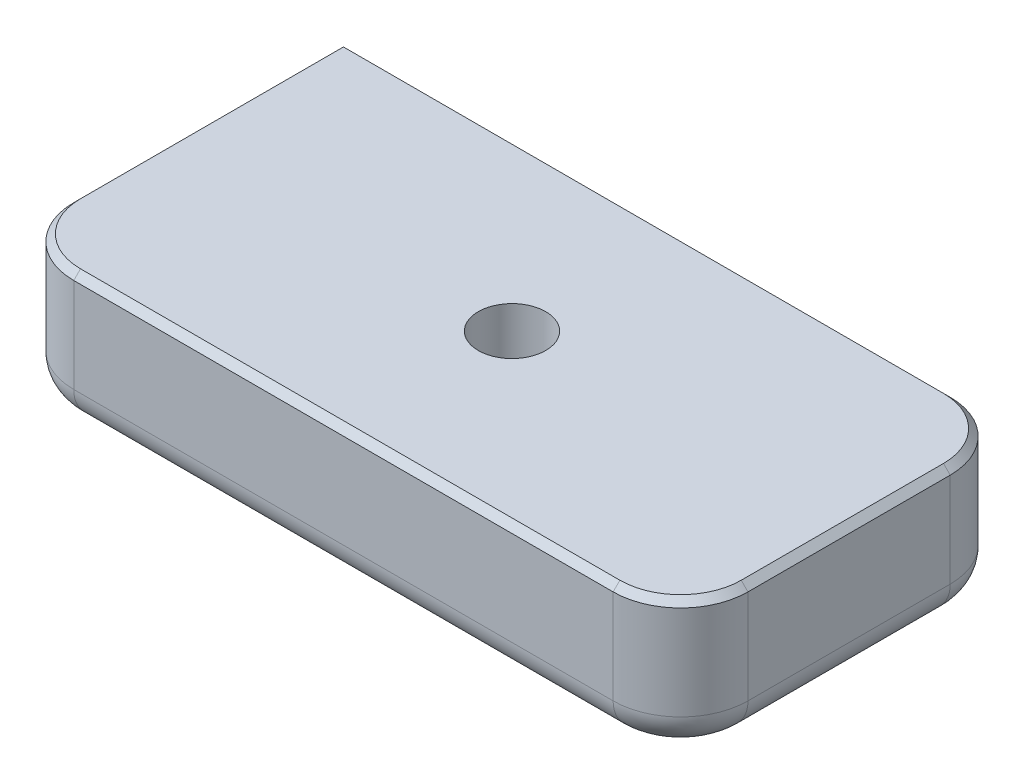
ISO-10303-21;
HEADER;
FILE_DESCRIPTION(('STEP AP214'),'2;1');
FILE_NAME('part.step','',(''),(''),'','','');
FILE_SCHEMA(('AUTOMOTIVE_DESIGN { 1 0 10303 214 1 1 1 1 }'));
ENDSEC;
DATA;
#1=APPLICATION_CONTEXT('core data for automotive mechanical design processes');
#2=APPLICATION_PROTOCOL_DEFINITION('international standard','automotive_design',2000,#1);
#3=PRODUCT_CONTEXT('',#1,'mechanical');
#4=PRODUCT('Part','Part','',(#3));
#5=PRODUCT_RELATED_PRODUCT_CATEGORY('part','',(#4));
#6=PRODUCT_DEFINITION_FORMATION('','',#4);
#7=PRODUCT_DEFINITION_CONTEXT('part definition',#1,'design');
#8=PRODUCT_DEFINITION('design','',#6,#7);
#9=PRODUCT_DEFINITION_SHAPE('','',#8);
#10=(LENGTH_UNIT() NAMED_UNIT(*) SI_UNIT(.MILLI.,.METRE.));
#11=(NAMED_UNIT(*) PLANE_ANGLE_UNIT() SI_UNIT($,.RADIAN.));
#12=(NAMED_UNIT(*) SI_UNIT($,.STERADIAN.) SOLID_ANGLE_UNIT());
#13=UNCERTAINTY_MEASURE_WITH_UNIT(LENGTH_MEASURE(1.E-05),#10,'distance_accuracy_value','');
#14=(GEOMETRIC_REPRESENTATION_CONTEXT(3) GLOBAL_UNCERTAINTY_ASSIGNED_CONTEXT((#13)) GLOBAL_UNIT_ASSIGNED_CONTEXT((#10,
#11,#12)) REPRESENTATION_CONTEXT('',''));
#15=CARTESIAN_POINT('',(0.,0.,0.));
#16=DIRECTION('',(0.,0.,1.));
#17=DIRECTION('',(1.,0.,0.));
#18=AXIS2_PLACEMENT_3D('',#15,#16,#17);
#19=CARTESIAN_POINT('',(50.,20.,-25.));
#20=DIRECTION('',(-1.,0.,0.));
#21=DIRECTION('',(0.,0.,1.));
#22=AXIS2_PLACEMENT_3D('',#19,#20,#21);
#23=PLANE('',#22);
#24=DIRECTION('',(0.,-1.,0.));
#25=VECTOR('',#24,1.);
#26=CARTESIAN_POINT('',(50.,20.,15.));
#27=LINE('',#26,#25);
#28=CARTESIAN_POINT('',(50.,19.,15.));
#29=VERTEX_POINT('',#28);
#30=CARTESIAN_POINT('',(50.,5.,15.));
#31=VERTEX_POINT('',#30);
#32=EDGE_CURVE('E275',#29,#31,#27,.T.);
#33=ORIENTED_EDGE('',*,*,#32,.T.);
#34=DIRECTION('',(0.,0.,-1.));
#35=VECTOR('',#34,1.);
#36=CARTESIAN_POINT('',(50.,5.,-25.));
#37=LINE('',#36,#35);
#38=CARTESIAN_POINT('',(50.,5.,-15.));
#39=VERTEX_POINT('',#38);
#40=EDGE_CURVE('E210',#31,#39,#37,.T.);
#41=ORIENTED_EDGE('',*,*,#40,.T.);
#42=DIRECTION('',(0.,-1.,0.));
#43=VECTOR('',#42,1.);
#44=CARTESIAN_POINT('',(50.,20.,-15.));
#45=LINE('',#44,#43);
#46=CARTESIAN_POINT('',(50.,19.,-15.));
#47=VERTEX_POINT('',#46);
#48=EDGE_CURVE('E272',#39,#47,#45,.F.);
#49=ORIENTED_EDGE('',*,*,#48,.T.);
#50=DIRECTION('',(0.,0.,1.));
#51=VECTOR('',#50,1.);
#52=CARTESIAN_POINT('',(50.,19.,15.));
#53=LINE('',#52,#51);
#54=EDGE_CURVE('E252',#47,#29,#53,.T.);
#55=ORIENTED_EDGE('',*,*,#54,.T.);
#56=EDGE_LOOP('',(#33,#41,#49,#55));
#57=FACE_BOUND('',#56,.T.);
#58=ADVANCED_FACE('F36',(#57),#23,.F.);
#59=CARTESIAN_POINT('',(-50.,20.,-25.));
#60=DIRECTION('',(0.,0.,1.));
#61=DIRECTION('',(1.,0.,0.));
#62=AXIS2_PLACEMENT_3D('',#59,#60,#61);
#63=PLANE('',#62);
#64=DIRECTION('',(0.,-1.,0.));
#65=VECTOR('',#64,1.);
#66=CARTESIAN_POINT('',(40.,20.,-25.));
#67=LINE('',#66,#65);
#68=CARTESIAN_POINT('',(40.,19.,-25.));
#69=VERTEX_POINT('',#68);
#70=CARTESIAN_POINT('',(40.,5.,-25.));
#71=VERTEX_POINT('',#70);
#72=EDGE_CURVE('E291',#69,#71,#67,.T.);
#73=ORIENTED_EDGE('',*,*,#72,.T.);
#74=DIRECTION('',(-1.,0.,0.));
#75=VECTOR('',#74,1.);
#76=CARTESIAN_POINT('',(-50.,5.,-25.));
#77=LINE('',#76,#75);
#78=CARTESIAN_POINT('',(-50.,5.,-25.));
#79=VERTEX_POINT('',#78);
#80=EDGE_CURVE('E206',#71,#79,#77,.T.);
#81=ORIENTED_EDGE('',*,*,#80,.T.);
#82=DIRECTION('',(0.,-1.,0.));
#83=VECTOR('',#82,1.);
#84=CARTESIAN_POINT('',(-50.,20.,-25.));
#85=LINE('',#84,#83);
#86=CARTESIAN_POINT('',(-50.,19.,-25.));
#87=VERTEX_POINT('',#86);
#88=EDGE_CURVE('E182',#87,#79,#85,.T.);
#89=ORIENTED_EDGE('',*,*,#88,.F.);
#90=DIRECTION('',(1.,0.,0.));
#91=VECTOR('',#90,1.);
#92=CARTESIAN_POINT('',(40.,19.,-25.));
#93=LINE('',#92,#91);
#94=EDGE_CURVE('E257',#87,#69,#93,.T.);
#95=ORIENTED_EDGE('',*,*,#94,.T.);
#96=EDGE_LOOP('',(#73,#81,#89,#95));
#97=FACE_BOUND('',#96,.T.);
#98=ADVANCED_FACE('F290',(#97),#63,.F.);
#99=CARTESIAN_POINT('',(-50.,20.,-25.));
#100=DIRECTION('',(1.,0.,0.));
#101=DIRECTION('',(0.,0.,-1.));
#102=AXIS2_PLACEMENT_3D('',#99,#100,#101);
#103=PLANE('',#102);
#104=ORIENTED_EDGE('',*,*,#88,.T.);
#105=DIRECTION('',(0.,0.,1.));
#106=VECTOR('',#105,1.);
#107=CARTESIAN_POINT('',(-50.,5.,-25.));
#108=LINE('',#107,#106);
#109=CARTESIAN_POINT('',(-50.,5.,15.));
#110=VERTEX_POINT('',#109);
#111=EDGE_CURVE('E185',#79,#110,#108,.T.);
#112=ORIENTED_EDGE('',*,*,#111,.T.);
#113=DIRECTION('',(0.,-1.,0.));
#114=VECTOR('',#113,1.);
#115=CARTESIAN_POINT('',(-50.,20.,15.));
#116=LINE('',#115,#114);
#117=CARTESIAN_POINT('',(-50.,19.,15.));
#118=VERTEX_POINT('',#117);
#119=EDGE_CURVE('E162',#110,#118,#116,.F.);
#120=ORIENTED_EDGE('',*,*,#119,.T.);
#121=DIRECTION('',(0.,0.,-1.));
#122=VECTOR('',#121,1.);
#123=CARTESIAN_POINT('',(-50.,19.,-25.));
#124=LINE('',#123,#122);
#125=EDGE_CURVE('E248',#118,#87,#124,.T.);
#126=ORIENTED_EDGE('',*,*,#125,.T.);
#127=EDGE_LOOP('',(#104,#112,#120,#126));
#128=FACE_BOUND('',#127,.T.);
#129=ADVANCED_FACE('F301',(#128),#103,.F.);
#130=CARTESIAN_POINT('',(-50.,20.,25.));
#131=DIRECTION('',(0.,0.,-1.));
#132=DIRECTION('',(-1.,0.,0.));
#133=AXIS2_PLACEMENT_3D('',#130,#131,#132);
#134=PLANE('',#133);
#135=DIRECTION('',(0.,-1.,0.));
#136=VECTOR('',#135,1.);
#137=CARTESIAN_POINT('',(-40.,20.,25.));
#138=LINE('',#137,#136);
#139=CARTESIAN_POINT('',(-40.,19.,25.));
#140=VERTEX_POINT('',#139);
#141=CARTESIAN_POINT('',(-40.,5.,25.));
#142=VERTEX_POINT('',#141);
#143=EDGE_CURVE('E266',#140,#142,#138,.T.);
#144=ORIENTED_EDGE('',*,*,#143,.T.);
#145=DIRECTION('',(1.,0.,0.));
#146=VECTOR('',#145,1.);
#147=CARTESIAN_POINT('',(-50.,5.,25.));
#148=LINE('',#147,#146);
#149=CARTESIAN_POINT('',(40.,5.,25.));
#150=VERTEX_POINT('',#149);
#151=EDGE_CURVE('E12',#142,#150,#148,.T.);
#152=ORIENTED_EDGE('',*,*,#151,.T.);
#153=DIRECTION('',(0.,-1.,0.));
#154=VECTOR('',#153,1.);
#155=CARTESIAN_POINT('',(40.,20.,25.));
#156=LINE('',#155,#154);
#157=CARTESIAN_POINT('',(40.,19.,25.));
#158=VERTEX_POINT('',#157);
#159=EDGE_CURVE('E267',#150,#158,#156,.F.);
#160=ORIENTED_EDGE('',*,*,#159,.T.);
#161=DIRECTION('',(-1.,0.,0.));
#162=VECTOR('',#161,1.);
#163=CARTESIAN_POINT('',(-40.,19.,25.));
#164=LINE('',#163,#162);
#165=EDGE_CURVE('E189',#158,#140,#164,.T.);
#166=ORIENTED_EDGE('',*,*,#165,.T.);
#167=EDGE_LOOP('',(#144,#152,#160,#166));
#168=FACE_BOUND('',#167,.T.);
#169=ADVANCED_FACE('F265',(#168),#134,.F.);
#170=CARTESIAN_POINT('',(0.,20.,0.));
#171=DIRECTION('',(0.,1.,0.));
#172=DIRECTION('',(0.,0.,1.));
#173=AXIS2_PLACEMENT_3D('',#170,#171,#172);
#174=PLANE('',#173);
#175=CARTESIAN_POINT('',(40.,20.,-15.));
#176=DIRECTION('',(0.,1.,0.));
#177=DIRECTION('',(0.,0.,1.));
#178=AXIS2_PLACEMENT_3D('',#175,#176,#177);
#179=CIRCLE('',#178,9.);
#180=CARTESIAN_POINT('',(49.,20.,-15.));
#181=VERTEX_POINT('',#180);
#182=CARTESIAN_POINT('',(40.,20.,-24.));
#183=VERTEX_POINT('',#182);
#184=EDGE_CURVE('E283',#181,#183,#179,.T.);
#185=ORIENTED_EDGE('',*,*,#184,.T.);
#186=DIRECTION('',(-1.,0.,0.));
#187=VECTOR('',#186,1.);
#188=CARTESIAN_POINT('',(-50.,20.,-24.));
#189=LINE('',#188,#187);
#190=CARTESIAN_POINT('',(-49.,20.,-24.));
#191=VERTEX_POINT('',#190);
#192=EDGE_CURVE('E285',#183,#191,#189,.T.);
#193=ORIENTED_EDGE('',*,*,#192,.T.);
#194=DIRECTION('',(0.,0.,1.));
#195=VECTOR('',#194,1.);
#196=CARTESIAN_POINT('',(-49.,20.,15.));
#197=LINE('',#196,#195);
#198=CARTESIAN_POINT('',(-49.,20.,15.));
#199=VERTEX_POINT('',#198);
#200=EDGE_CURVE('E145',#191,#199,#197,.T.);
#201=ORIENTED_EDGE('',*,*,#200,.T.);
#202=CARTESIAN_POINT('',(-40.,20.,15.));
#203=DIRECTION('',(0.,1.,0.));
#204=DIRECTION('',(0.,0.,1.));
#205=AXIS2_PLACEMENT_3D('',#202,#203,#204);
#206=CIRCLE('',#205,9.);
#207=CARTESIAN_POINT('',(-40.,20.,24.));
#208=VERTEX_POINT('',#207);
#209=EDGE_CURVE('E137',#199,#208,#206,.T.);
#210=ORIENTED_EDGE('',*,*,#209,.T.);
#211=DIRECTION('',(1.,0.,0.));
#212=VECTOR('',#211,1.);
#213=CARTESIAN_POINT('',(40.,20.,24.));
#214=LINE('',#213,#212);
#215=CARTESIAN_POINT('',(40.,20.,24.));
#216=VERTEX_POINT('',#215);
#217=EDGE_CURVE('E141',#208,#216,#214,.T.);
#218=ORIENTED_EDGE('',*,*,#217,.T.);
#219=CARTESIAN_POINT('',(40.,20.,15.));
#220=DIRECTION('',(0.,1.,0.));
#221=DIRECTION('',(0.,0.,1.));
#222=AXIS2_PLACEMENT_3D('',#219,#220,#221);
#223=CIRCLE('',#222,9.);
#224=CARTESIAN_POINT('',(49.,20.,15.));
#225=VERTEX_POINT('',#224);
#226=EDGE_CURVE('E151',#216,#225,#223,.T.);
#227=ORIENTED_EDGE('',*,*,#226,.T.);
#228=DIRECTION('',(0.,0.,-1.));
#229=VECTOR('',#228,1.);
#230=CARTESIAN_POINT('',(49.,20.,-15.));
#231=LINE('',#230,#229);
#232=EDGE_CURVE('E150',#225,#181,#231,.T.);
#233=ORIENTED_EDGE('',*,*,#232,.T.);
#234=EDGE_LOOP('',(#185,#193,#201,#210,#218,#227,#233));
#235=FACE_BOUND('',#234,.T.);
#236=CARTESIAN_POINT('',(0.,20.,0.));
#237=DIRECTION('',(0.,1.,0.));
#238=DIRECTION('',(0.,0.,1.));
#239=AXIS2_PLACEMENT_3D('',#236,#237,#238);
#240=CIRCLE('',#239,5.);
#241=CARTESIAN_POINT('',(0.,20.,5.));
#242=VERTEX_POINT('',#241);
#243=EDGE_CURVE('E178',#242,#242,#240,.T.);
#244=ORIENTED_EDGE('',*,*,#243,.F.);
#245=EDGE_LOOP('',(#244));
#246=FACE_BOUND('',#245,.T.);
#247=ADVANCED_FACE('F139',(#235,#246),#174,.T.);
#248=CARTESIAN_POINT('',(0.,0.,0.));
#249=DIRECTION('',(0.,1.,0.));
#250=DIRECTION('',(0.,0.,1.));
#251=AXIS2_PLACEMENT_3D('',#248,#249,#250);
#252=PLANE('',#251);
#253=CARTESIAN_POINT('',(-40.,0.,15.));
#254=DIRECTION('',(0.,1.,0.));
#255=DIRECTION('',(0.,0.,1.));
#256=AXIS2_PLACEMENT_3D('',#253,#254,#255);
#257=CIRCLE('',#256,5.);
#258=CARTESIAN_POINT('',(-40.,0.,20.));
#259=VERTEX_POINT('',#258);
#260=CARTESIAN_POINT('',(-45.,0.,15.));
#261=VERTEX_POINT('',#260);
#262=EDGE_CURVE('E199',#259,#261,#257,.F.);
#263=ORIENTED_EDGE('',*,*,#262,.T.);
#264=DIRECTION('',(0.,0.,1.));
#265=VECTOR('',#264,1.);
#266=CARTESIAN_POINT('',(-45.,0.,0.));
#267=LINE('',#266,#265);
#268=CARTESIAN_POINT('',(-45.,0.,-20.));
#269=VERTEX_POINT('',#268);
#270=EDGE_CURVE('E201',#261,#269,#267,.F.);
#271=ORIENTED_EDGE('',*,*,#270,.T.);
#272=DIRECTION('',(-1.,0.,0.));
#273=VECTOR('',#272,1.);
#274=CARTESIAN_POINT('',(0.,0.,-20.));
#275=LINE('',#274,#273);
#276=CARTESIAN_POINT('',(40.,0.,-20.));
#277=VERTEX_POINT('',#276);
#278=EDGE_CURVE('E197',#269,#277,#275,.F.);
#279=ORIENTED_EDGE('',*,*,#278,.T.);
#280=CARTESIAN_POINT('',(40.,0.,-15.));
#281=DIRECTION('',(0.,1.,0.));
#282=DIRECTION('',(0.,0.,1.));
#283=AXIS2_PLACEMENT_3D('',#280,#281,#282);
#284=CIRCLE('',#283,5.);
#285=CARTESIAN_POINT('',(45.,0.,-15.));
#286=VERTEX_POINT('',#285);
#287=EDGE_CURVE('E195',#277,#286,#284,.F.);
#288=ORIENTED_EDGE('',*,*,#287,.T.);
#289=DIRECTION('',(0.,0.,-1.));
#290=VECTOR('',#289,1.);
#291=CARTESIAN_POINT('',(45.,0.,0.));
#292=LINE('',#291,#290);
#293=CARTESIAN_POINT('',(45.,0.,15.));
#294=VERTEX_POINT('',#293);
#295=EDGE_CURVE('E193',#286,#294,#292,.F.);
#296=ORIENTED_EDGE('',*,*,#295,.T.);
#297=CARTESIAN_POINT('',(40.,0.,15.));
#298=DIRECTION('',(0.,1.,0.));
#299=DIRECTION('',(0.,0.,1.));
#300=AXIS2_PLACEMENT_3D('',#297,#298,#299);
#301=CIRCLE('',#300,5.);
#302=CARTESIAN_POINT('',(40.,0.,20.));
#303=VERTEX_POINT('',#302);
#304=EDGE_CURVE('E191',#294,#303,#301,.F.);
#305=ORIENTED_EDGE('',*,*,#304,.T.);
#306=DIRECTION('',(1.,0.,0.));
#307=VECTOR('',#306,1.);
#308=CARTESIAN_POINT('',(0.,0.,20.));
#309=LINE('',#308,#307);
#310=EDGE_CURVE('E188',#303,#259,#309,.F.);
#311=ORIENTED_EDGE('',*,*,#310,.T.);
#312=EDGE_LOOP('',(#263,#271,#279,#288,#296,#305,#311));
#313=FACE_BOUND('',#312,.T.);
#314=CARTESIAN_POINT('',(0.,0.,0.));
#315=DIRECTION('',(0.,1.,0.));
#316=DIRECTION('',(0.,0.,1.));
#317=AXIS2_PLACEMENT_3D('',#314,#315,#316);
#318=CIRCLE('',#317,5.);
#319=CARTESIAN_POINT('',(0.,0.,5.));
#320=VERTEX_POINT('',#319);
#321=EDGE_CURVE('E179',#320,#320,#318,.T.);
#322=ORIENTED_EDGE('',*,*,#321,.T.);
#323=EDGE_LOOP('',(#322));
#324=FACE_BOUND('',#323,.T.);
#325=ADVANCED_FACE('F321',(#313,#324),#252,.F.);
#326=CARTESIAN_POINT('',(0.,0.,0.));
#327=DIRECTION('',(0.,1.,0.));
#328=DIRECTION('',(0.,0.,1.));
#329=AXIS2_PLACEMENT_3D('',#326,#327,#328);
#330=CYLINDRICAL_SURFACE('',#329,5.);
#331=ORIENTED_EDGE('',*,*,#321,.F.);
#332=EDGE_LOOP('',(#331));
#333=FACE_BOUND('',#332,.T.);
#334=ORIENTED_EDGE('',*,*,#243,.T.);
#335=EDGE_LOOP('',(#334));
#336=FACE_BOUND('',#335,.T.);
#337=ADVANCED_FACE('F359',(#333,#336),#330,.F.);
#338=CARTESIAN_POINT('',(40.,20.,-15.));
#339=DIRECTION('',(0.,-1.,0.));
#340=DIRECTION('',(0.,0.,-1.));
#341=AXIS2_PLACEMENT_3D('',#338,#339,#340);
#342=CYLINDRICAL_SURFACE('',#341,10.);
#343=ORIENTED_EDGE('',*,*,#48,.F.);
#344=CARTESIAN_POINT('',(40.,5.,-15.));
#345=DIRECTION('',(0.,1.,0.));
#346=DIRECTION('',(0.,0.,1.));
#347=AXIS2_PLACEMENT_3D('',#344,#345,#346);
#348=CIRCLE('',#347,10.);
#349=EDGE_CURVE('E208',#39,#71,#348,.T.);
#350=ORIENTED_EDGE('',*,*,#349,.T.);
#351=ORIENTED_EDGE('',*,*,#72,.F.);
#352=CARTESIAN_POINT('',(40.,19.,-15.));
#353=DIRECTION('',(0.,1.,0.));
#354=DIRECTION('',(0.,0.,1.));
#355=AXIS2_PLACEMENT_3D('',#352,#353,#354);
#356=CIRCLE('',#355,10.);
#357=EDGE_CURVE('E253',#69,#47,#356,.F.);
#358=ORIENTED_EDGE('',*,*,#357,.T.);
#359=EDGE_LOOP('',(#343,#350,#351,#358));
#360=FACE_BOUND('',#359,.T.);
#361=ADVANCED_FACE('F295',(#360),#342,.T.);
#362=CARTESIAN_POINT('',(40.,20.,15.));
#363=DIRECTION('',(0.,-1.,0.));
#364=DIRECTION('',(0.,0.,-1.));
#365=AXIS2_PLACEMENT_3D('',#362,#363,#364);
#366=CYLINDRICAL_SURFACE('',#365,10.);
#367=ORIENTED_EDGE('',*,*,#159,.F.);
#368=CARTESIAN_POINT('',(40.,5.,15.));
#369=DIRECTION('',(0.,1.,0.));
#370=DIRECTION('',(0.,0.,1.));
#371=AXIS2_PLACEMENT_3D('',#368,#369,#370);
#372=CIRCLE('',#371,10.);
#373=EDGE_CURVE('E45',#150,#31,#372,.T.);
#374=ORIENTED_EDGE('',*,*,#373,.T.);
#375=ORIENTED_EDGE('',*,*,#32,.F.);
#376=CARTESIAN_POINT('',(40.,19.,15.));
#377=DIRECTION('',(0.,1.,0.));
#378=DIRECTION('',(0.,0.,1.));
#379=AXIS2_PLACEMENT_3D('',#376,#377,#378);
#380=CIRCLE('',#379,10.);
#381=EDGE_CURVE('E261',#29,#158,#380,.F.);
#382=ORIENTED_EDGE('',*,*,#381,.T.);
#383=EDGE_LOOP('',(#367,#374,#375,#382));
#384=FACE_BOUND('',#383,.T.);
#385=ADVANCED_FACE('F327',(#384),#366,.T.);
#386=CARTESIAN_POINT('',(-40.,20.,15.));
#387=DIRECTION('',(0.,-1.,0.));
#388=DIRECTION('',(0.,0.,-1.));
#389=AXIS2_PLACEMENT_3D('',#386,#387,#388);
#390=CYLINDRICAL_SURFACE('',#389,10.);
#391=ORIENTED_EDGE('',*,*,#119,.F.);
#392=CARTESIAN_POINT('',(-40.,5.,15.));
#393=DIRECTION('',(0.,1.,0.));
#394=DIRECTION('',(0.,0.,1.));
#395=AXIS2_PLACEMENT_3D('',#392,#393,#394);
#396=CIRCLE('',#395,10.);
#397=EDGE_CURVE('E204',#110,#142,#396,.T.);
#398=ORIENTED_EDGE('',*,*,#397,.T.);
#399=ORIENTED_EDGE('',*,*,#143,.F.);
#400=CARTESIAN_POINT('',(-40.,19.,15.));
#401=DIRECTION('',(0.,1.,0.));
#402=DIRECTION('',(0.,0.,1.));
#403=AXIS2_PLACEMENT_3D('',#400,#401,#402);
#404=CIRCLE('',#403,10.);
#405=EDGE_CURVE('E166',#140,#118,#404,.F.);
#406=ORIENTED_EDGE('',*,*,#405,.T.);
#407=EDGE_LOOP('',(#391,#398,#399,#406));
#408=FACE_BOUND('',#407,.T.);
#409=ADVANCED_FACE('F270',(#408),#390,.T.);
#410=CARTESIAN_POINT('',(40.,20.,15.));
#411=DIRECTION('',(0.,-1.,0.));
#412=DIRECTION('',(0.,0.,-1.));
#413=AXIS2_PLACEMENT_3D('',#410,#411,#412);
#414=CONICAL_SURFACE('',#413,9.,0.785398163397447);
#415=DIRECTION('',(0.707106781186547,-0.707106781186547,0.));
#416=VECTOR('',#415,1.);
#417=CARTESIAN_POINT('',(49.,20.,15.));
#418=LINE('',#417,#416);
#419=EDGE_CURVE('E167',#225,#29,#418,.T.);
#420=ORIENTED_EDGE('',*,*,#419,.F.);
#421=ORIENTED_EDGE('',*,*,#226,.F.);
#422=DIRECTION('',(0.,0.707106781186547,-0.707106781186547));
#423=VECTOR('',#422,1.);
#424=CARTESIAN_POINT('',(40.,19.,25.));
#425=LINE('',#424,#423);
#426=EDGE_CURVE('E161',#158,#216,#425,.T.);
#427=ORIENTED_EDGE('',*,*,#426,.F.);
#428=ORIENTED_EDGE('',*,*,#381,.F.);
#429=EDGE_LOOP('',(#420,#421,#427,#428));
#430=FACE_BOUND('',#429,.T.);
#431=ADVANCED_FACE('F330',(#430),#414,.T.);
#432=CARTESIAN_POINT('',(0.,20.,24.));
#433=DIRECTION('',(0.,0.707106781186547,0.707106781186548));
#434=DIRECTION('',(-1.,0.,0.));
#435=AXIS2_PLACEMENT_3D('',#432,#433,#434);
#436=PLANE('',#435);
#437=ORIENTED_EDGE('',*,*,#426,.T.);
#438=ORIENTED_EDGE('',*,*,#217,.F.);
#439=DIRECTION('',(0.,0.707106781186547,-0.707106781186547));
#440=VECTOR('',#439,1.);
#441=CARTESIAN_POINT('',(-40.,19.,25.));
#442=LINE('',#441,#440);
#443=EDGE_CURVE('E158',#140,#208,#442,.T.);
#444=ORIENTED_EDGE('',*,*,#443,.F.);
#445=ORIENTED_EDGE('',*,*,#165,.F.);
#446=EDGE_LOOP('',(#437,#438,#444,#445));
#447=FACE_BOUND('',#446,.T.);
#448=ADVANCED_FACE('F156',(#447),#436,.T.);
#449=CARTESIAN_POINT('',(49.,20.,0.));
#450=DIRECTION('',(0.707106781186547,0.707106781186547,0.));
#451=DIRECTION('',(0.,0.,1.));
#452=AXIS2_PLACEMENT_3D('',#449,#450,#451);
#453=PLANE('',#452);
#454=ORIENTED_EDGE('',*,*,#419,.T.);
#455=ORIENTED_EDGE('',*,*,#54,.F.);
#456=DIRECTION('',(0.707106781186547,-0.707106781186547,0.));
#457=VECTOR('',#456,1.);
#458=CARTESIAN_POINT('',(49.,20.,-15.));
#459=LINE('',#458,#457);
#460=EDGE_CURVE('E168',#181,#47,#459,.T.);
#461=ORIENTED_EDGE('',*,*,#460,.F.);
#462=ORIENTED_EDGE('',*,*,#232,.F.);
#463=EDGE_LOOP('',(#454,#455,#461,#462));
#464=FACE_BOUND('',#463,.T.);
#465=ADVANCED_FACE('F333',(#464),#453,.T.);
#466=CARTESIAN_POINT('',(-40.,20.,15.));
#467=DIRECTION('',(0.,-1.,0.));
#468=DIRECTION('',(0.,0.,-1.));
#469=AXIS2_PLACEMENT_3D('',#466,#467,#468);
#470=CONICAL_SURFACE('',#469,9.,0.785398163397447);
#471=ORIENTED_EDGE('',*,*,#443,.T.);
#472=ORIENTED_EDGE('',*,*,#209,.F.);
#473=DIRECTION('',(0.707106781186547,0.707106781186547,0.));
#474=VECTOR('',#473,1.);
#475=CARTESIAN_POINT('',(-50.,19.,15.));
#476=LINE('',#475,#474);
#477=EDGE_CURVE('E173',#118,#199,#476,.T.);
#478=ORIENTED_EDGE('',*,*,#477,.F.);
#479=ORIENTED_EDGE('',*,*,#405,.F.);
#480=EDGE_LOOP('',(#471,#472,#478,#479));
#481=FACE_BOUND('',#480,.T.);
#482=ADVANCED_FACE('F164',(#481),#470,.T.);
#483=CARTESIAN_POINT('',(40.,20.,-15.));
#484=DIRECTION('',(0.,-1.,0.));
#485=DIRECTION('',(0.,0.,-1.));
#486=AXIS2_PLACEMENT_3D('',#483,#484,#485);
#487=CONICAL_SURFACE('',#486,9.,0.785398163397447);
#488=ORIENTED_EDGE('',*,*,#460,.T.);
#489=ORIENTED_EDGE('',*,*,#357,.F.);
#490=DIRECTION('',(0.,-0.707106781186547,-0.707106781186547));
#491=VECTOR('',#490,1.);
#492=CARTESIAN_POINT('',(40.,20.,-24.));
#493=LINE('',#492,#491);
#494=EDGE_CURVE('E236',#183,#69,#493,.T.);
#495=ORIENTED_EDGE('',*,*,#494,.F.);
#496=ORIENTED_EDGE('',*,*,#184,.F.);
#497=EDGE_LOOP('',(#488,#489,#495,#496));
#498=FACE_BOUND('',#497,.T.);
#499=ADVANCED_FACE('F338',(#498),#487,.T.);
#500=CARTESIAN_POINT('',(-49.,20.,0.));
#501=DIRECTION('',(-0.707106781186547,0.707106781186547,0.));
#502=DIRECTION('',(0.,0.,-1.));
#503=AXIS2_PLACEMENT_3D('',#500,#501,#502);
#504=PLANE('',#503);
#505=ORIENTED_EDGE('',*,*,#477,.T.);
#506=ORIENTED_EDGE('',*,*,#200,.F.);
#507=DIRECTION('',(-0.577350269189626,-0.577350269189626,-0.577350269189625));
#508=VECTOR('',#507,1.);
#509=CARTESIAN_POINT('',(-41.,28.,-16.));
#510=LINE('',#509,#508);
#511=EDGE_CURVE('E232',#87,#191,#510,.F.);
#512=ORIENTED_EDGE('',*,*,#511,.F.);
#513=ORIENTED_EDGE('',*,*,#125,.F.);
#514=EDGE_LOOP('',(#505,#506,#512,#513));
#515=FACE_BOUND('',#514,.T.);
#516=ADVANCED_FACE('F247',(#515),#504,.T.);
#517=CARTESIAN_POINT('',(0.,20.,-24.));
#518=DIRECTION('',(0.,0.707106781186547,-0.707106781186548));
#519=DIRECTION('',(1.,0.,0.));
#520=AXIS2_PLACEMENT_3D('',#517,#518,#519);
#521=PLANE('',#520);
#522=ORIENTED_EDGE('',*,*,#494,.T.);
#523=ORIENTED_EDGE('',*,*,#94,.F.);
#524=ORIENTED_EDGE('',*,*,#511,.T.);
#525=ORIENTED_EDGE('',*,*,#192,.F.);
#526=EDGE_LOOP('',(#522,#523,#524,#525));
#527=FACE_BOUND('',#526,.T.);
#528=ADVANCED_FACE('F339',(#527),#521,.T.);
#529=CARTESIAN_POINT('',(45.,5.,-25.));
#530=DIRECTION('',(0.,0.,-1.));
#531=DIRECTION('',(-1.,0.,0.));
#532=AXIS2_PLACEMENT_3D('',#529,#530,#531);
#533=CYLINDRICAL_SURFACE('',#532,5.);
#534=CARTESIAN_POINT('',(45.,5.,-15.));
#535=DIRECTION('',(0.,0.,-1.));
#536=DIRECTION('',(-1.,0.,0.));
#537=AXIS2_PLACEMENT_3D('',#534,#535,#536);
#538=CIRCLE('',#537,5.);
#539=EDGE_CURVE('E225',#39,#286,#538,.T.);
#540=ORIENTED_EDGE('',*,*,#539,.F.);
#541=ORIENTED_EDGE('',*,*,#40,.F.);
#542=CARTESIAN_POINT('',(45.,5.,15.));
#543=DIRECTION('',(0.,0.,1.));
#544=DIRECTION('',(1.,0.,0.));
#545=AXIS2_PLACEMENT_3D('',#542,#543,#544);
#546=CIRCLE('',#545,5.);
#547=EDGE_CURVE('E40',#294,#31,#546,.T.);
#548=ORIENTED_EDGE('',*,*,#547,.F.);
#549=ORIENTED_EDGE('',*,*,#295,.F.);
#550=EDGE_LOOP('',(#540,#541,#548,#549));
#551=FACE_BOUND('',#550,.T.);
#552=ADVANCED_FACE('F38',(#551),#533,.T.);
#553=CARTESIAN_POINT('',(40.,5.,15.));
#554=DIRECTION('',(0.,1.,0.));
#555=DIRECTION('',(0.,0.,1.));
#556=AXIS2_PLACEMENT_3D('',#553,#554,#555);
#557=DEGENERATE_TOROIDAL_SURFACE('',#556,5.,5.,.T.);
#558=ORIENTED_EDGE('',*,*,#547,.T.);
#559=ORIENTED_EDGE('',*,*,#373,.F.);
#560=CARTESIAN_POINT('',(40.,5.,20.));
#561=DIRECTION('',(-1.,0.,0.));
#562=DIRECTION('',(0.,0.,1.));
#563=AXIS2_PLACEMENT_3D('',#560,#561,#562);
#564=CIRCLE('',#563,5.);
#565=EDGE_CURVE('E223',#303,#150,#564,.T.);
#566=ORIENTED_EDGE('',*,*,#565,.F.);
#567=ORIENTED_EDGE('',*,*,#304,.F.);
#568=EDGE_LOOP('',(#558,#559,#566,#567));
#569=FACE_BOUND('',#568,.T.);
#570=ADVANCED_FACE('F319',(#569),#557,.T.);
#571=CARTESIAN_POINT('',(40.,5.,-15.));
#572=DIRECTION('',(0.,1.,0.));
#573=DIRECTION('',(0.,0.,1.));
#574=AXIS2_PLACEMENT_3D('',#571,#572,#573);
#575=DEGENERATE_TOROIDAL_SURFACE('',#574,5.,5.,.T.);
#576=ORIENTED_EDGE('',*,*,#539,.T.);
#577=ORIENTED_EDGE('',*,*,#287,.F.);
#578=CARTESIAN_POINT('',(40.,5.,-20.));
#579=DIRECTION('',(-1.,0.,0.));
#580=DIRECTION('',(0.,0.,1.));
#581=AXIS2_PLACEMENT_3D('',#578,#579,#580);
#582=CIRCLE('',#581,5.);
#583=EDGE_CURVE('E220',#71,#277,#582,.T.);
#584=ORIENTED_EDGE('',*,*,#583,.F.);
#585=ORIENTED_EDGE('',*,*,#349,.F.);
#586=EDGE_LOOP('',(#576,#577,#584,#585));
#587=FACE_BOUND('',#586,.T.);
#588=ADVANCED_FACE('F383',(#587),#575,.T.);
#589=CARTESIAN_POINT('',(-50.,5.,20.));
#590=DIRECTION('',(1.,0.,0.));
#591=DIRECTION('',(0.,0.,-1.));
#592=AXIS2_PLACEMENT_3D('',#589,#590,#591);
#593=CYLINDRICAL_SURFACE('',#592,5.);
#594=ORIENTED_EDGE('',*,*,#565,.T.);
#595=ORIENTED_EDGE('',*,*,#151,.F.);
#596=CARTESIAN_POINT('',(-40.,5.,20.));
#597=DIRECTION('',(-1.,0.,0.));
#598=DIRECTION('',(0.,0.,1.));
#599=AXIS2_PLACEMENT_3D('',#596,#597,#598);
#600=CIRCLE('',#599,5.);
#601=EDGE_CURVE('E217',#259,#142,#600,.T.);
#602=ORIENTED_EDGE('',*,*,#601,.F.);
#603=ORIENTED_EDGE('',*,*,#310,.F.);
#604=EDGE_LOOP('',(#594,#595,#602,#603));
#605=FACE_BOUND('',#604,.T.);
#606=ADVANCED_FACE('F317',(#605),#593,.T.);
#607=CARTESIAN_POINT('',(-50.,5.,-20.));
#608=DIRECTION('',(-1.,0.,0.));
#609=DIRECTION('',(0.,0.,1.));
#610=AXIS2_PLACEMENT_3D('',#607,#608,#609);
#611=CYLINDRICAL_SURFACE('',#610,5.);
#612=ORIENTED_EDGE('',*,*,#583,.T.);
#613=ORIENTED_EDGE('',*,*,#278,.F.);
#614=CARTESIAN_POINT('',(-45.,5.,-20.));
#615=DIRECTION('',(-0.707106781186547,0.,0.707106781186547));
#616=DIRECTION('',(-0.707106781186547,0.,-0.707106781186547));
#617=AXIS2_PLACEMENT_3D('',#614,#615,#616);
#618=ELLIPSE('',#617,7.07106781186547,5.);
#619=EDGE_CURVE('E215',#79,#269,#618,.T.);
#620=ORIENTED_EDGE('',*,*,#619,.F.);
#621=ORIENTED_EDGE('',*,*,#80,.F.);
#622=EDGE_LOOP('',(#612,#613,#620,#621));
#623=FACE_BOUND('',#622,.T.);
#624=ADVANCED_FACE('F306',(#623),#611,.T.);
#625=CARTESIAN_POINT('',(-40.,5.,15.));
#626=DIRECTION('',(0.,1.,0.));
#627=DIRECTION('',(0.,0.,1.));
#628=AXIS2_PLACEMENT_3D('',#625,#626,#627);
#629=DEGENERATE_TOROIDAL_SURFACE('',#628,5.,5.,.T.);
#630=ORIENTED_EDGE('',*,*,#601,.T.);
#631=ORIENTED_EDGE('',*,*,#397,.F.);
#632=CARTESIAN_POINT('',(-45.,5.,15.));
#633=DIRECTION('',(0.,0.,-1.));
#634=DIRECTION('',(-1.,0.,0.));
#635=AXIS2_PLACEMENT_3D('',#632,#633,#634);
#636=CIRCLE('',#635,5.);
#637=EDGE_CURVE('E213',#261,#110,#636,.T.);
#638=ORIENTED_EDGE('',*,*,#637,.F.);
#639=ORIENTED_EDGE('',*,*,#262,.F.);
#640=EDGE_LOOP('',(#630,#631,#638,#639));
#641=FACE_BOUND('',#640,.T.);
#642=ADVANCED_FACE('F313',(#641),#629,.T.);
#643=CARTESIAN_POINT('',(-45.,5.,-25.));
#644=DIRECTION('',(0.,0.,1.));
#645=DIRECTION('',(1.,0.,0.));
#646=AXIS2_PLACEMENT_3D('',#643,#644,#645);
#647=CYLINDRICAL_SURFACE('',#646,5.);
#648=ORIENTED_EDGE('',*,*,#619,.T.);
#649=ORIENTED_EDGE('',*,*,#270,.F.);
#650=ORIENTED_EDGE('',*,*,#637,.T.);
#651=ORIENTED_EDGE('',*,*,#111,.F.);
#652=EDGE_LOOP('',(#648,#649,#650,#651));
#653=FACE_BOUND('',#652,.T.);
#654=ADVANCED_FACE('F309',(#653),#647,.T.);
#655=CLOSED_SHELL('',(#58,#98,#129,#169,#247,#325,#337,#361,#385,#409,#431,#448,#465,#482,#499,
#516,#528,#552,#570,#588,#606,#624,#642,#654));
#656=MANIFOLD_SOLID_BREP('B2',#655);
#657=ADVANCED_BREP_SHAPE_REPRESENTATION('',(#18,#656),#14);
#658=SHAPE_DEFINITION_REPRESENTATION(#9,#657);
ENDSEC;
END-ISO-10303-21;
